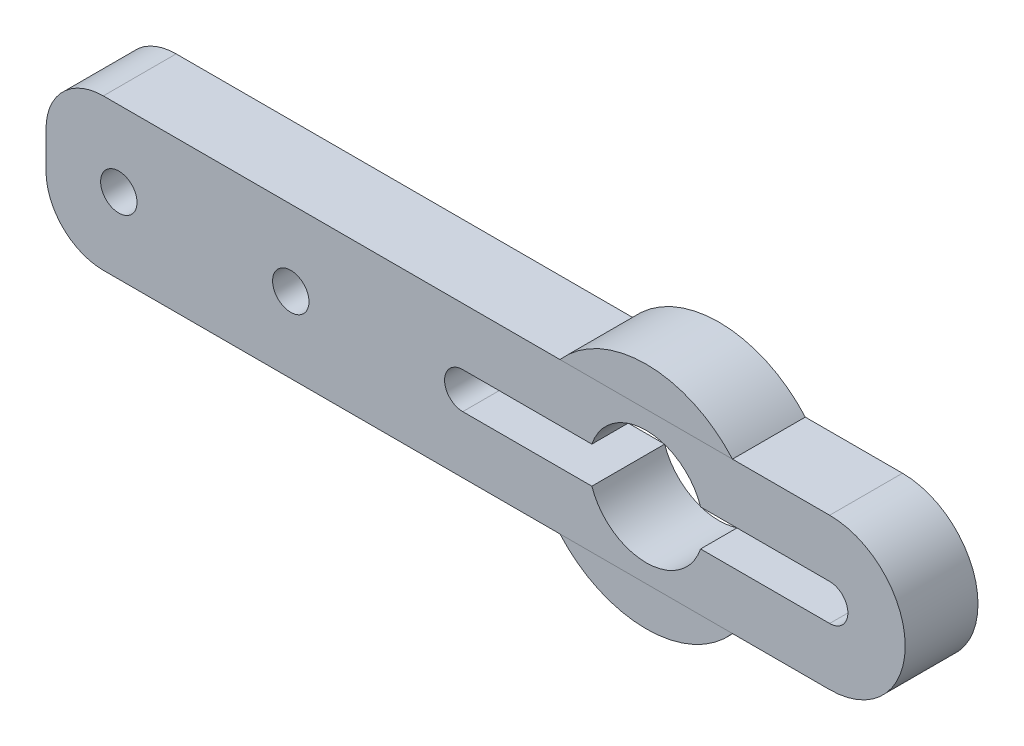
ISO-10303-21;
HEADER;
FILE_DESCRIPTION(('STEP AP214'),'2;1');
FILE_NAME('part.step','',(''),(''),'','','');
FILE_SCHEMA(('AUTOMOTIVE_DESIGN { 1 0 10303 214 1 1 1 1 }'));
ENDSEC;
DATA;
#1=APPLICATION_CONTEXT('core data for automotive mechanical design processes');
#2=APPLICATION_PROTOCOL_DEFINITION('international standard','automotive_design',2000,#1);
#3=PRODUCT_CONTEXT('',#1,'mechanical');
#4=PRODUCT('Part','Part','',(#3));
#5=PRODUCT_RELATED_PRODUCT_CATEGORY('part','',(#4));
#6=PRODUCT_DEFINITION_FORMATION('','',#4);
#7=PRODUCT_DEFINITION_CONTEXT('part definition',#1,'design');
#8=PRODUCT_DEFINITION('design','',#6,#7);
#9=PRODUCT_DEFINITION_SHAPE('','',#8);
#10=(LENGTH_UNIT() NAMED_UNIT(*) SI_UNIT(.MILLI.,.METRE.));
#11=(NAMED_UNIT(*) PLANE_ANGLE_UNIT() SI_UNIT($,.RADIAN.));
#12=(NAMED_UNIT(*) SI_UNIT($,.STERADIAN.) SOLID_ANGLE_UNIT());
#13=UNCERTAINTY_MEASURE_WITH_UNIT(LENGTH_MEASURE(1.E-05),#10,'distance_accuracy_value','');
#14=(GEOMETRIC_REPRESENTATION_CONTEXT(3) GLOBAL_UNCERTAINTY_ASSIGNED_CONTEXT((#13)) GLOBAL_UNIT_ASSIGNED_CONTEXT((#10,
#11,#12)) REPRESENTATION_CONTEXT('',''));
#15=CARTESIAN_POINT('',(0.,0.,0.));
#16=DIRECTION('',(0.,0.,1.));
#17=DIRECTION('',(1.,0.,0.));
#18=AXIS2_PLACEMENT_3D('',#15,#16,#17);
#19=CARTESIAN_POINT('',(0.,6.5875,0.));
#20=DIRECTION('',(0.,1.,0.));
#21=DIRECTION('',(0.,0.,1.));
#22=AXIS2_PLACEMENT_3D('',#19,#20,#21);
#23=PLANE('',#22);
#24=DIRECTION('',(-1.,0.,0.));
#25=VECTOR('',#24,1.);
#26=CARTESIAN_POINT('',(0.,6.5875,6.35));
#27=LINE('',#26,#25);
#28=CARTESIAN_POINT('',(23.5236190593357,6.5875,6.35));
#29=VERTEX_POINT('',#28);
#30=CARTESIAN_POINT('',(8.47638094066426,6.5875,6.35));
#31=VERTEX_POINT('',#30);
#32=EDGE_CURVE('E77',#29,#31,#27,.T.);
#33=ORIENTED_EDGE('',*,*,#32,.T.);
#34=DIRECTION('',(0.,0.,1.));
#35=VECTOR('',#34,1.);
#36=CARTESIAN_POINT('',(8.47638094066426,6.5875,0.));
#37=LINE('',#36,#35);
#38=CARTESIAN_POINT('',(8.47638094066426,6.5875,0.));
#39=VERTEX_POINT('',#38);
#40=EDGE_CURVE('E12',#39,#31,#37,.T.);
#41=ORIENTED_EDGE('',*,*,#40,.F.);
#42=DIRECTION('',(-1.,0.,0.));
#43=VECTOR('',#42,1.);
#44=CARTESIAN_POINT('',(0.,6.5875,0.));
#45=LINE('',#44,#43);
#46=CARTESIAN_POINT('',(23.5236190593357,6.5875,0.));
#47=VERTEX_POINT('',#46);
#48=EDGE_CURVE('E61',#47,#39,#45,.T.);
#49=ORIENTED_EDGE('',*,*,#48,.F.);
#50=DIRECTION('',(0.,0.,1.));
#51=VECTOR('',#50,1.);
#52=CARTESIAN_POINT('',(23.5236190593357,6.5875,0.));
#53=LINE('',#52,#51);
#54=EDGE_CURVE('E49',#47,#29,#53,.T.);
#55=ORIENTED_EDGE('',*,*,#54,.T.);
#56=EDGE_LOOP('',(#33,#41,#49,#55));
#57=FACE_BOUND('',#56,.T.);
#58=ADVANCED_FACE('F46',(#57),#23,.F.);
#59=CARTESIAN_POINT('',(16.,0.,0.));
#60=DIRECTION('',(0.,0.,1.));
#61=DIRECTION('',(1.,0.,0.));
#62=AXIS2_PLACEMENT_3D('',#59,#60,#61);
#63=CYLINDRICAL_SURFACE('',#62,10.);
#64=CARTESIAN_POINT('',(16.,0.,6.35));
#65=DIRECTION('',(0.,0.,1.));
#66=DIRECTION('',(1.,0.,0.));
#67=AXIS2_PLACEMENT_3D('',#64,#65,#66);
#68=CIRCLE('',#67,10.);
#69=EDGE_CURVE('E75',#29,#31,#68,.T.);
#70=ORIENTED_EDGE('',*,*,#69,.F.);
#71=ORIENTED_EDGE('',*,*,#54,.F.);
#72=CARTESIAN_POINT('',(16.,0.,0.));
#73=DIRECTION('',(0.,0.,1.));
#74=DIRECTION('',(1.,0.,0.));
#75=AXIS2_PLACEMENT_3D('',#72,#73,#74);
#76=CIRCLE('',#75,10.);
#77=EDGE_CURVE('E76',#47,#39,#76,.T.);
#78=ORIENTED_EDGE('',*,*,#77,.T.);
#79=ORIENTED_EDGE('',*,*,#40,.T.);
#80=EDGE_LOOP('',(#70,#71,#78,#79));
#81=FACE_BOUND('',#80,.T.);
#82=ADVANCED_FACE('F73',(#81),#63,.T.);
#83=CARTESIAN_POINT('',(0.,0.,0.));
#84=DIRECTION('',(0.,0.,1.));
#85=DIRECTION('',(1.,0.,0.));
#86=AXIS2_PLACEMENT_3D('',#83,#84,#85);
#87=PLANE('',#86);
#88=ORIENTED_EDGE('',*,*,#48,.T.);
#89=ORIENTED_EDGE('',*,*,#77,.F.);
#90=EDGE_LOOP('',(#88,#89));
#91=FACE_BOUND('',#90,.T.);
#92=ADVANCED_FACE('F85',(#91),#87,.F.);
#93=CARTESIAN_POINT('',(0.,0.,6.35));
#94=DIRECTION('',(0.,0.,1.));
#95=DIRECTION('',(1.,0.,0.));
#96=AXIS2_PLACEMENT_3D('',#93,#94,#95);
#97=PLANE('',#96);
#98=ORIENTED_EDGE('',*,*,#32,.F.);
#99=ORIENTED_EDGE('',*,*,#69,.T.);
#100=EDGE_LOOP('',(#98,#99));
#101=FACE_BOUND('',#100,.T.);
#102=ADVANCED_FACE('F80',(#101),#97,.T.);
#103=CLOSED_SHELL('',(#58,#82,#92,#102));
#104=MANIFOLD_SOLID_BREP('B2',#103);
#105=CARTESIAN_POINT('',(0.,-6.5875,0.));
#106=DIRECTION('',(0.,-1.,0.));
#107=DIRECTION('',(0.,0.,-1.));
#108=AXIS2_PLACEMENT_3D('',#105,#106,#107);
#109=PLANE('',#108);
#110=DIRECTION('',(1.,0.,0.));
#111=VECTOR('',#110,1.);
#112=CARTESIAN_POINT('',(0.,-6.5875,6.35));
#113=LINE('',#112,#111);
#114=CARTESIAN_POINT('',(8.47638094066426,-6.5875,6.35));
#115=VERTEX_POINT('',#114);
#116=CARTESIAN_POINT('',(23.5236190593357,-6.5875,6.35));
#117=VERTEX_POINT('',#116);
#118=EDGE_CURVE('E158',#115,#117,#113,.T.);
#119=ORIENTED_EDGE('',*,*,#118,.T.);
#120=DIRECTION('',(0.,0.,1.));
#121=VECTOR('',#120,1.);
#122=CARTESIAN_POINT('',(23.5236190593357,-6.5875,0.));
#123=LINE('',#122,#121);
#124=CARTESIAN_POINT('',(23.5236190593357,-6.5875,0.));
#125=VERTEX_POINT('',#124);
#126=EDGE_CURVE('E44',#125,#117,#123,.T.);
#127=ORIENTED_EDGE('',*,*,#126,.F.);
#128=DIRECTION('',(1.,0.,0.));
#129=VECTOR('',#128,1.);
#130=CARTESIAN_POINT('',(0.,-6.5875,0.));
#131=LINE('',#130,#129);
#132=CARTESIAN_POINT('',(8.47638094066426,-6.5875,0.));
#133=VERTEX_POINT('',#132);
#134=EDGE_CURVE('E142',#133,#125,#131,.T.);
#135=ORIENTED_EDGE('',*,*,#134,.F.);
#136=DIRECTION('',(0.,0.,1.));
#137=VECTOR('',#136,1.);
#138=CARTESIAN_POINT('',(8.47638094066426,-6.5875,0.));
#139=LINE('',#138,#137);
#140=EDGE_CURVE('E130',#133,#115,#139,.T.);
#141=ORIENTED_EDGE('',*,*,#140,.T.);
#142=EDGE_LOOP('',(#119,#127,#135,#141));
#143=FACE_BOUND('',#142,.T.);
#144=ADVANCED_FACE('F127',(#143),#109,.F.);
#145=CARTESIAN_POINT('',(16.,0.,0.));
#146=DIRECTION('',(0.,0.,1.));
#147=DIRECTION('',(1.,0.,0.));
#148=AXIS2_PLACEMENT_3D('',#145,#146,#147);
#149=CYLINDRICAL_SURFACE('',#148,10.);
#150=CARTESIAN_POINT('',(16.,0.,6.35));
#151=DIRECTION('',(0.,0.,1.));
#152=DIRECTION('',(1.,0.,0.));
#153=AXIS2_PLACEMENT_3D('',#150,#151,#152);
#154=CIRCLE('',#153,10.);
#155=EDGE_CURVE('E156',#115,#117,#154,.T.);
#156=ORIENTED_EDGE('',*,*,#155,.F.);
#157=ORIENTED_EDGE('',*,*,#140,.F.);
#158=CARTESIAN_POINT('',(16.,0.,0.));
#159=DIRECTION('',(0.,0.,1.));
#160=DIRECTION('',(1.,0.,0.));
#161=AXIS2_PLACEMENT_3D('',#158,#159,#160);
#162=CIRCLE('',#161,10.);
#163=EDGE_CURVE('E157',#133,#125,#162,.T.);
#164=ORIENTED_EDGE('',*,*,#163,.T.);
#165=ORIENTED_EDGE('',*,*,#126,.T.);
#166=EDGE_LOOP('',(#156,#157,#164,#165));
#167=FACE_BOUND('',#166,.T.);
#168=ADVANCED_FACE('F154',(#167),#149,.T.);
#169=CARTESIAN_POINT('',(0.,0.,0.));
#170=DIRECTION('',(0.,0.,1.));
#171=DIRECTION('',(1.,0.,0.));
#172=AXIS2_PLACEMENT_3D('',#169,#170,#171);
#173=PLANE('',#172);
#174=ORIENTED_EDGE('',*,*,#134,.T.);
#175=ORIENTED_EDGE('',*,*,#163,.F.);
#176=EDGE_LOOP('',(#174,#175));
#177=FACE_BOUND('',#176,.T.);
#178=ADVANCED_FACE('F166',(#177),#173,.F.);
#179=CARTESIAN_POINT('',(0.,0.,6.35));
#180=DIRECTION('',(0.,0.,1.));
#181=DIRECTION('',(1.,0.,0.));
#182=AXIS2_PLACEMENT_3D('',#179,#180,#181);
#183=PLANE('',#182);
#184=ORIENTED_EDGE('',*,*,#118,.F.);
#185=ORIENTED_EDGE('',*,*,#155,.T.);
#186=EDGE_LOOP('',(#184,#185));
#187=FACE_BOUND('',#186,.T.);
#188=ADVANCED_FACE('F161',(#187),#183,.T.);
#189=CLOSED_SHELL('',(#144,#168,#178,#188));
#190=MANIFOLD_SOLID_BREP('B6',#189);
#191=CARTESIAN_POINT('',(0.,-1.5875,6.35));
#192=DIRECTION('',(0.,1.,0.));
#193=DIRECTION('',(0.,0.,1.));
#194=AXIS2_PLACEMENT_3D('',#191,#192,#193);
#195=PLANE('',#194);
#196=DIRECTION('',(0.,0.,1.));
#197=VECTOR('',#196,1.);
#198=CARTESIAN_POINT('',(11.2587086410979,-1.5875,0.));
#199=LINE('',#198,#197);
#200=CARTESIAN_POINT('',(11.2587086410979,-1.5875,0.));
#201=VERTEX_POINT('',#200);
#202=CARTESIAN_POINT('',(11.2587086410979,-1.5875,6.35));
#203=VERTEX_POINT('',#202);
#204=EDGE_CURVE('E416',#201,#203,#199,.T.);
#205=ORIENTED_EDGE('',*,*,#204,.F.);
#206=DIRECTION('',(1.,0.,0.));
#207=VECTOR('',#206,1.);
#208=CARTESIAN_POINT('',(0.,-1.5875,0.));
#209=LINE('',#208,#207);
#210=CARTESIAN_POINT('',(0.,-1.5875,0.));
#211=VERTEX_POINT('',#210);
#212=EDGE_CURVE('E330',#211,#201,#209,.T.);
#213=ORIENTED_EDGE('',*,*,#212,.F.);
#214=DIRECTION('',(0.,0.,-1.));
#215=VECTOR('',#214,1.);
#216=CARTESIAN_POINT('',(0.,-1.5875,6.35));
#217=LINE('',#216,#215);
#218=CARTESIAN_POINT('',(0.,-1.5875,6.35));
#219=VERTEX_POINT('',#218);
#220=EDGE_CURVE('E344',#219,#211,#217,.T.);
#221=ORIENTED_EDGE('',*,*,#220,.F.);
#222=DIRECTION('',(1.,0.,0.));
#223=VECTOR('',#222,1.);
#224=CARTESIAN_POINT('',(0.,-1.5875,6.35));
#225=LINE('',#224,#223);
#226=EDGE_CURVE('E399',#219,#203,#225,.T.);
#227=ORIENTED_EDGE('',*,*,#226,.T.);
#228=EDGE_LOOP('',(#205,#213,#221,#227));
#229=FACE_BOUND('',#228,.T.);
#230=ADVANCED_FACE('F199',(#229),#195,.T.);
#231=CARTESIAN_POINT('',(0.,1.5875,6.35));
#232=DIRECTION('',(0.,-1.,0.));
#233=DIRECTION('',(0.,0.,-1.));
#234=AXIS2_PLACEMENT_3D('',#231,#232,#233);
#235=PLANE('',#234);
#236=DIRECTION('',(0.,0.,1.));
#237=VECTOR('',#236,1.);
#238=CARTESIAN_POINT('',(20.7412913589021,1.5875,0.));
#239=LINE('',#238,#237);
#240=CARTESIAN_POINT('',(20.7412913589021,1.5875,0.));
#241=VERTEX_POINT('',#240);
#242=CARTESIAN_POINT('',(20.7412913589021,1.5875,6.35));
#243=VERTEX_POINT('',#242);
#244=EDGE_CURVE('E125',#241,#243,#239,.T.);
#245=ORIENTED_EDGE('',*,*,#244,.F.);
#246=DIRECTION('',(-1.,0.,0.));
#247=VECTOR('',#246,1.);
#248=CARTESIAN_POINT('',(0.,1.5875,0.));
#249=LINE('',#248,#247);
#250=CARTESIAN_POINT('',(32.,1.5875,0.));
#251=VERTEX_POINT('',#250);
#252=EDGE_CURVE('E337',#251,#241,#249,.T.);
#253=ORIENTED_EDGE('',*,*,#252,.F.);
#254=DIRECTION('',(0.,0.,-1.));
#255=VECTOR('',#254,1.);
#256=CARTESIAN_POINT('',(32.,1.5875,6.35));
#257=LINE('',#256,#255);
#258=CARTESIAN_POINT('',(32.,1.5875,6.35));
#259=VERTEX_POINT('',#258);
#260=EDGE_CURVE('E316',#259,#251,#257,.T.);
#261=ORIENTED_EDGE('',*,*,#260,.F.);
#262=DIRECTION('',(-1.,0.,0.));
#263=VECTOR('',#262,1.);
#264=CARTESIAN_POINT('',(0.,1.5875,6.35));
#265=LINE('',#264,#263);
#266=EDGE_CURVE('E310',#259,#243,#265,.T.);
#267=ORIENTED_EDGE('',*,*,#266,.T.);
#268=EDGE_LOOP('',(#245,#253,#261,#267));
#269=FACE_BOUND('',#268,.T.);
#270=ADVANCED_FACE('F315',(#269),#235,.T.);
#271=CARTESIAN_POINT('',(0.,0.,6.35));
#272=DIRECTION('',(0.,0.,1.));
#273=DIRECTION('',(1.,0.,0.));
#274=AXIS2_PLACEMENT_3D('',#271,#272,#273);
#275=PLANE('',#274);
#276=CARTESIAN_POINT('',(16.,0.,6.35));
#277=DIRECTION('',(0.,0.,1.));
#278=DIRECTION('',(1.,0.,0.));
#279=AXIS2_PLACEMENT_3D('',#276,#277,#278);
#280=CIRCLE('',#279,5.);
#281=CARTESIAN_POINT('',(11.2587086410979,1.5875,6.35));
#282=VERTEX_POINT('',#281);
#283=EDGE_CURVE('E221',#243,#282,#280,.T.);
#284=ORIENTED_EDGE('',*,*,#283,.F.);
#285=ORIENTED_EDGE('',*,*,#266,.F.);
#286=CARTESIAN_POINT('',(32.,0.,6.35));
#287=DIRECTION('',(0.,0.,1.));
#288=DIRECTION('',(1.,0.,0.));
#289=AXIS2_PLACEMENT_3D('',#286,#287,#288);
#290=CIRCLE('',#289,1.5875);
#291=CARTESIAN_POINT('',(32.,-1.5875,6.35));
#292=VERTEX_POINT('',#291);
#293=EDGE_CURVE('E322',#292,#259,#290,.T.);
#294=ORIENTED_EDGE('',*,*,#293,.F.);
#295=CARTESIAN_POINT('',(20.7412913589021,-1.5875,6.35));
#296=VERTEX_POINT('',#295);
#297=EDGE_CURVE('E400',#296,#292,#225,.T.);
#298=ORIENTED_EDGE('',*,*,#297,.F.);
#299=EDGE_CURVE('E214',#203,#296,#280,.T.);
#300=ORIENTED_EDGE('',*,*,#299,.F.);
#301=ORIENTED_EDGE('',*,*,#226,.F.);
#302=CARTESIAN_POINT('',(0.,0.,6.35));
#303=DIRECTION('',(0.,0.,1.));
#304=DIRECTION('',(1.,0.,0.));
#305=AXIS2_PLACEMENT_3D('',#302,#303,#304);
#306=CIRCLE('',#305,1.5875);
#307=CARTESIAN_POINT('',(0.,1.5875,6.35));
#308=VERTEX_POINT('',#307);
#309=EDGE_CURVE('E338',#308,#219,#306,.T.);
#310=ORIENTED_EDGE('',*,*,#309,.F.);
#311=EDGE_CURVE('E312',#282,#308,#265,.T.);
#312=ORIENTED_EDGE('',*,*,#311,.F.);
#313=EDGE_LOOP('',(#284,#285,#294,#298,#300,#301,#310,#312));
#314=FACE_BOUND('',#313,.T.);
#315=DIRECTION('',(-1.,0.,0.));
#316=VECTOR('',#315,1.);
#317=CARTESIAN_POINT('',(0.,6.5875,6.35));
#318=LINE('',#317,#316);
#319=CARTESIAN_POINT('',(32.,6.5875,6.35));
#320=VERTEX_POINT('',#319);
#321=CARTESIAN_POINT('',(-31.35,6.5875,6.35));
#322=VERTEX_POINT('',#321);
#323=EDGE_CURVE('E353',#320,#322,#318,.T.);
#324=ORIENTED_EDGE('',*,*,#323,.T.);
#325=CARTESIAN_POINT('',(-31.35,1.5875,6.35));
#326=DIRECTION('',(0.,0.,1.));
#327=DIRECTION('',(1.,0.,0.));
#328=AXIS2_PLACEMENT_3D('',#325,#326,#327);
#329=CIRCLE('',#328,5.);
#330=CARTESIAN_POINT('',(-36.35,1.5875,6.35));
#331=VERTEX_POINT('',#330);
#332=EDGE_CURVE('E372',#322,#331,#329,.T.);
#333=ORIENTED_EDGE('',*,*,#332,.T.);
#334=DIRECTION('',(0.,-1.,0.));
#335=VECTOR('',#334,1.);
#336=CARTESIAN_POINT('',(-36.35,-6.5875,6.35));
#337=LINE('',#336,#335);
#338=CARTESIAN_POINT('',(-36.35,-1.5875,6.35));
#339=VERTEX_POINT('',#338);
#340=EDGE_CURVE('E403',#331,#339,#337,.T.);
#341=ORIENTED_EDGE('',*,*,#340,.T.);
#342=CARTESIAN_POINT('',(-31.35,-1.5875,6.35));
#343=DIRECTION('',(0.,0.,1.));
#344=DIRECTION('',(1.,0.,0.));
#345=AXIS2_PLACEMENT_3D('',#342,#343,#344);
#346=CIRCLE('',#345,5.);
#347=CARTESIAN_POINT('',(-31.35,-6.5875,6.35));
#348=VERTEX_POINT('',#347);
#349=EDGE_CURVE('E370',#339,#348,#346,.T.);
#350=ORIENTED_EDGE('',*,*,#349,.T.);
#351=DIRECTION('',(1.,0.,0.));
#352=VECTOR('',#351,1.);
#353=CARTESIAN_POINT('',(0.,-6.5875,6.35));
#354=LINE('',#353,#352);
#355=CARTESIAN_POINT('',(32.,-6.5875,6.35));
#356=VERTEX_POINT('',#355);
#357=EDGE_CURVE('E348',#348,#356,#354,.T.);
#358=ORIENTED_EDGE('',*,*,#357,.T.);
#359=CARTESIAN_POINT('',(32.,0.,6.35));
#360=DIRECTION('',(0.,0.,1.));
#361=DIRECTION('',(1.,0.,0.));
#362=AXIS2_PLACEMENT_3D('',#359,#360,#361);
#363=CIRCLE('',#362,6.5875);
#364=EDGE_CURVE('E350',#356,#320,#363,.T.);
#365=ORIENTED_EDGE('',*,*,#364,.T.);
#366=EDGE_LOOP('',(#324,#333,#341,#350,#358,#365));
#367=FACE_BOUND('',#366,.T.);
#368=CARTESIAN_POINT('',(-30.,0.,6.35));
#369=DIRECTION('',(0.,0.,1.));
#370=DIRECTION('',(1.,0.,0.));
#371=AXIS2_PLACEMENT_3D('',#368,#369,#370);
#372=CIRCLE('',#371,1.5875);
#373=CARTESIAN_POINT('',(-28.4125,0.,6.35));
#374=VERTEX_POINT('',#373);
#375=EDGE_CURVE('E418',#374,#374,#372,.T.);
#376=ORIENTED_EDGE('',*,*,#375,.F.);
#377=EDGE_LOOP('',(#376));
#378=FACE_BOUND('',#377,.T.);
#379=CARTESIAN_POINT('',(-15.,0.,6.35));
#380=DIRECTION('',(0.,0.,1.));
#381=DIRECTION('',(1.,0.,0.));
#382=AXIS2_PLACEMENT_3D('',#379,#380,#381);
#383=CIRCLE('',#382,1.5875);
#384=CARTESIAN_POINT('',(-13.4125,0.,6.35));
#385=VERTEX_POINT('',#384);
#386=EDGE_CURVE('E424',#385,#385,#383,.T.);
#387=ORIENTED_EDGE('',*,*,#386,.F.);
#388=EDGE_LOOP('',(#387));
#389=FACE_BOUND('',#388,.T.);
#390=ADVANCED_FACE('F307',(#314,#367,#378,#389),#275,.T.);
#391=CARTESIAN_POINT('',(0.,0.,0.));
#392=DIRECTION('',(0.,0.,1.));
#393=DIRECTION('',(1.,0.,0.));
#394=AXIS2_PLACEMENT_3D('',#391,#392,#393);
#395=PLANE('',#394);
#396=DIRECTION('',(0.,-1.,0.));
#397=VECTOR('',#396,1.);
#398=CARTESIAN_POINT('',(-36.35,-6.5875,0.));
#399=LINE('',#398,#397);
#400=CARTESIAN_POINT('',(-36.35,1.5875,0.));
#401=VERTEX_POINT('',#400);
#402=CARTESIAN_POINT('',(-36.35,-1.5875,0.));
#403=VERTEX_POINT('',#402);
#404=EDGE_CURVE('E329',#401,#403,#399,.T.);
#405=ORIENTED_EDGE('',*,*,#404,.F.);
#406=CARTESIAN_POINT('',(-31.35,1.5875,0.));
#407=DIRECTION('',(0.,0.,1.));
#408=DIRECTION('',(1.,0.,0.));
#409=AXIS2_PLACEMENT_3D('',#406,#407,#408);
#410=CIRCLE('',#409,5.);
#411=CARTESIAN_POINT('',(-31.35,6.5875,0.));
#412=VERTEX_POINT('',#411);
#413=EDGE_CURVE('E381',#401,#412,#410,.F.);
#414=ORIENTED_EDGE('',*,*,#413,.T.);
#415=DIRECTION('',(-1.,0.,0.));
#416=VECTOR('',#415,1.);
#417=CARTESIAN_POINT('',(0.,6.5875,0.));
#418=LINE('',#417,#416);
#419=CARTESIAN_POINT('',(32.,6.5875,0.));
#420=VERTEX_POINT('',#419);
#421=EDGE_CURVE('E351',#420,#412,#418,.T.);
#422=ORIENTED_EDGE('',*,*,#421,.F.);
#423=CARTESIAN_POINT('',(32.,0.,0.));
#424=DIRECTION('',(0.,0.,1.));
#425=DIRECTION('',(1.,0.,0.));
#426=AXIS2_PLACEMENT_3D('',#423,#424,#425);
#427=CIRCLE('',#426,6.5875);
#428=CARTESIAN_POINT('',(32.,-6.5875,0.));
#429=VERTEX_POINT('',#428);
#430=EDGE_CURVE('E358',#429,#420,#427,.T.);
#431=ORIENTED_EDGE('',*,*,#430,.F.);
#432=DIRECTION('',(1.,0.,0.));
#433=VECTOR('',#432,1.);
#434=CARTESIAN_POINT('',(0.,-6.5875,0.));
#435=LINE('',#434,#433);
#436=CARTESIAN_POINT('',(-31.35,-6.5875,0.));
#437=VERTEX_POINT('',#436);
#438=EDGE_CURVE('E347',#437,#429,#435,.T.);
#439=ORIENTED_EDGE('',*,*,#438,.F.);
#440=CARTESIAN_POINT('',(-31.35,-1.5875,0.));
#441=DIRECTION('',(0.,0.,1.));
#442=DIRECTION('',(1.,0.,0.));
#443=AXIS2_PLACEMENT_3D('',#440,#441,#442);
#444=CIRCLE('',#443,5.);
#445=EDGE_CURVE('E379',#437,#403,#444,.F.);
#446=ORIENTED_EDGE('',*,*,#445,.T.);
#447=EDGE_LOOP('',(#405,#414,#422,#431,#439,#446));
#448=FACE_BOUND('',#447,.T.);
#449=ORIENTED_EDGE('',*,*,#252,.T.);
#450=CARTESIAN_POINT('',(16.,0.,0.));
#451=DIRECTION('',(0.,0.,1.));
#452=DIRECTION('',(1.,0.,0.));
#453=AXIS2_PLACEMENT_3D('',#450,#451,#452);
#454=CIRCLE('',#453,5.);
#455=CARTESIAN_POINT('',(11.2587086410979,1.5875,0.));
#456=VERTEX_POINT('',#455);
#457=EDGE_CURVE('E299',#241,#456,#454,.T.);
#458=ORIENTED_EDGE('',*,*,#457,.T.);
#459=CARTESIAN_POINT('',(0.,1.5875,0.));
#460=VERTEX_POINT('',#459);
#461=EDGE_CURVE('E336',#456,#460,#249,.T.);
#462=ORIENTED_EDGE('',*,*,#461,.T.);
#463=CARTESIAN_POINT('',(0.,0.,0.));
#464=DIRECTION('',(0.,0.,1.));
#465=DIRECTION('',(1.,0.,0.));
#466=AXIS2_PLACEMENT_3D('',#463,#464,#465);
#467=CIRCLE('',#466,1.5875);
#468=EDGE_CURVE('E326',#460,#211,#467,.T.);
#469=ORIENTED_EDGE('',*,*,#468,.T.);
#470=ORIENTED_EDGE('',*,*,#212,.T.);
#471=CARTESIAN_POINT('',(20.7412913589021,-1.5875,0.));
#472=VERTEX_POINT('',#471);
#473=EDGE_CURVE('E313',#201,#472,#454,.T.);
#474=ORIENTED_EDGE('',*,*,#473,.T.);
#475=CARTESIAN_POINT('',(32.,-1.5875,0.));
#476=VERTEX_POINT('',#475);
#477=EDGE_CURVE('E328',#472,#476,#209,.T.);
#478=ORIENTED_EDGE('',*,*,#477,.T.);
#479=CARTESIAN_POINT('',(32.,0.,0.));
#480=DIRECTION('',(0.,0.,1.));
#481=DIRECTION('',(1.,0.,0.));
#482=AXIS2_PLACEMENT_3D('',#479,#480,#481);
#483=CIRCLE('',#482,1.5875);
#484=EDGE_CURVE('E333',#476,#251,#483,.T.);
#485=ORIENTED_EDGE('',*,*,#484,.T.);
#486=EDGE_LOOP('',(#449,#458,#462,#469,#470,#474,#478,#485));
#487=FACE_BOUND('',#486,.T.);
#488=CARTESIAN_POINT('',(-30.,0.,0.));
#489=DIRECTION('',(0.,0.,1.));
#490=DIRECTION('',(1.,0.,0.));
#491=AXIS2_PLACEMENT_3D('',#488,#489,#490);
#492=CIRCLE('',#491,1.5875);
#493=CARTESIAN_POINT('',(-28.4125,0.,0.));
#494=VERTEX_POINT('',#493);
#495=EDGE_CURVE('E421',#494,#494,#492,.T.);
#496=ORIENTED_EDGE('',*,*,#495,.T.);
#497=EDGE_LOOP('',(#496));
#498=FACE_BOUND('',#497,.T.);
#499=CARTESIAN_POINT('',(-15.,0.,0.));
#500=DIRECTION('',(0.,0.,1.));
#501=DIRECTION('',(1.,0.,0.));
#502=AXIS2_PLACEMENT_3D('',#499,#500,#501);
#503=CIRCLE('',#502,1.5875);
#504=CARTESIAN_POINT('',(-13.4125,0.,0.));
#505=VERTEX_POINT('',#504);
#506=EDGE_CURVE('E427',#505,#505,#503,.T.);
#507=ORIENTED_EDGE('',*,*,#506,.T.);
#508=EDGE_LOOP('',(#507));
#509=FACE_BOUND('',#508,.T.);
#510=ADVANCED_FACE('F387',(#448,#487,#498,#509),#395,.F.);
#511=CARTESIAN_POINT('',(0.,-6.5875,6.35));
#512=DIRECTION('',(0.,1.,0.));
#513=DIRECTION('',(0.,0.,1.));
#514=AXIS2_PLACEMENT_3D('',#511,#512,#513);
#515=PLANE('',#514);
#516=ORIENTED_EDGE('',*,*,#357,.F.);
#517=DIRECTION('',(0.,0.,1.));
#518=VECTOR('',#517,1.);
#519=CARTESIAN_POINT('',(-31.35,-6.5875,0.));
#520=LINE('',#519,#518);
#521=EDGE_CURVE('E383',#348,#437,#520,.F.);
#522=ORIENTED_EDGE('',*,*,#521,.T.);
#523=ORIENTED_EDGE('',*,*,#438,.T.);
#524=DIRECTION('',(0.,0.,-1.));
#525=VECTOR('',#524,1.);
#526=CARTESIAN_POINT('',(32.,-6.5875,6.35));
#527=LINE('',#526,#525);
#528=EDGE_CURVE('E364',#356,#429,#527,.T.);
#529=ORIENTED_EDGE('',*,*,#528,.F.);
#530=EDGE_LOOP('',(#516,#522,#523,#529));
#531=FACE_BOUND('',#530,.T.);
#532=ADVANCED_FACE('F461',(#531),#515,.F.);
#533=CARTESIAN_POINT('',(32.,0.,6.35));
#534=DIRECTION('',(0.,0.,-1.));
#535=DIRECTION('',(-1.,0.,0.));
#536=AXIS2_PLACEMENT_3D('',#533,#534,#535);
#537=CYLINDRICAL_SURFACE('',#536,6.5875);
#538=ORIENTED_EDGE('',*,*,#430,.T.);
#539=DIRECTION('',(0.,0.,-1.));
#540=VECTOR('',#539,1.);
#541=CARTESIAN_POINT('',(32.,6.5875,6.35));
#542=LINE('',#541,#540);
#543=EDGE_CURVE('E356',#320,#420,#542,.T.);
#544=ORIENTED_EDGE('',*,*,#543,.F.);
#545=ORIENTED_EDGE('',*,*,#364,.F.);
#546=ORIENTED_EDGE('',*,*,#528,.T.);
#547=EDGE_LOOP('',(#538,#544,#545,#546));
#548=FACE_BOUND('',#547,.T.);
#549=ADVANCED_FACE('F454',(#548),#537,.T.);
#550=CARTESIAN_POINT('',(0.,6.5875,6.35));
#551=DIRECTION('',(0.,-1.,0.));
#552=DIRECTION('',(0.,0.,-1.));
#553=AXIS2_PLACEMENT_3D('',#550,#551,#552);
#554=PLANE('',#553);
#555=ORIENTED_EDGE('',*,*,#421,.T.);
#556=DIRECTION('',(0.,0.,1.));
#557=VECTOR('',#556,1.);
#558=CARTESIAN_POINT('',(-31.35,6.5875,6.35));
#559=LINE('',#558,#557);
#560=EDGE_CURVE('E367',#412,#322,#559,.T.);
#561=ORIENTED_EDGE('',*,*,#560,.T.);
#562=ORIENTED_EDGE('',*,*,#323,.F.);
#563=ORIENTED_EDGE('',*,*,#543,.T.);
#564=EDGE_LOOP('',(#555,#561,#562,#563));
#565=FACE_BOUND('',#564,.T.);
#566=ADVANCED_FACE('F449',(#565),#554,.F.);
#567=CARTESIAN_POINT('',(0.,0.,6.35));
#568=DIRECTION('',(0.,0.,-1.));
#569=DIRECTION('',(-1.,0.,0.));
#570=AXIS2_PLACEMENT_3D('',#567,#568,#569);
#571=CYLINDRICAL_SURFACE('',#570,1.5875);
#572=ORIENTED_EDGE('',*,*,#220,.T.);
#573=ORIENTED_EDGE('',*,*,#468,.F.);
#574=DIRECTION('',(0.,0.,-1.));
#575=VECTOR('',#574,1.);
#576=CARTESIAN_POINT('',(0.,1.5875,6.35));
#577=LINE('',#576,#575);
#578=EDGE_CURVE('E318',#308,#460,#577,.T.);
#579=ORIENTED_EDGE('',*,*,#578,.F.);
#580=ORIENTED_EDGE('',*,*,#309,.T.);
#581=EDGE_LOOP('',(#572,#573,#579,#580));
#582=FACE_BOUND('',#581,.T.);
#583=ADVANCED_FACE('F395',(#582),#571,.F.);
#584=DIRECTION('',(0.,0.,1.));
#585=VECTOR('',#584,1.);
#586=CARTESIAN_POINT('',(20.7412913589021,-1.5875,0.));
#587=LINE('',#586,#585);
#588=EDGE_CURVE('E390',#296,#472,#587,.F.);
#589=ORIENTED_EDGE('',*,*,#588,.F.);
#590=ORIENTED_EDGE('',*,*,#297,.T.);
#591=DIRECTION('',(0.,0.,-1.));
#592=VECTOR('',#591,1.);
#593=CARTESIAN_POINT('',(32.,-1.5875,6.35));
#594=LINE('',#593,#592);
#595=EDGE_CURVE('E341',#292,#476,#594,.T.);
#596=ORIENTED_EDGE('',*,*,#595,.T.);
#597=ORIENTED_EDGE('',*,*,#477,.F.);
#598=EDGE_LOOP('',(#589,#590,#596,#597));
#599=FACE_BOUND('',#598,.T.);
#600=ADVANCED_FACE('F413',(#599),#195,.T.);
#601=CARTESIAN_POINT('',(32.,0.,6.35));
#602=DIRECTION('',(0.,0.,-1.));
#603=DIRECTION('',(-1.,0.,0.));
#604=AXIS2_PLACEMENT_3D('',#601,#602,#603);
#605=CYLINDRICAL_SURFACE('',#604,1.5875);
#606=ORIENTED_EDGE('',*,*,#484,.F.);
#607=ORIENTED_EDGE('',*,*,#595,.F.);
#608=ORIENTED_EDGE('',*,*,#293,.T.);
#609=ORIENTED_EDGE('',*,*,#260,.T.);
#610=EDGE_LOOP('',(#606,#607,#608,#609));
#611=FACE_BOUND('',#610,.T.);
#612=ADVANCED_FACE('F410',(#611),#605,.F.);
#613=DIRECTION('',(0.,0.,1.));
#614=VECTOR('',#613,1.);
#615=CARTESIAN_POINT('',(11.2587086410979,1.5875,0.));
#616=LINE('',#615,#614);
#617=EDGE_CURVE('E207',#282,#456,#616,.F.);
#618=ORIENTED_EDGE('',*,*,#617,.F.);
#619=ORIENTED_EDGE('',*,*,#311,.T.);
#620=ORIENTED_EDGE('',*,*,#578,.T.);
#621=ORIENTED_EDGE('',*,*,#461,.F.);
#622=EDGE_LOOP('',(#618,#619,#620,#621));
#623=FACE_BOUND('',#622,.T.);
#624=ADVANCED_FACE('F392',(#623),#235,.T.);
#625=CARTESIAN_POINT('',(-36.35,-6.5875,0.));
#626=DIRECTION('',(-1.,0.,0.));
#627=DIRECTION('',(0.,0.,1.));
#628=AXIS2_PLACEMENT_3D('',#625,#626,#627);
#629=PLANE('',#628);
#630=ORIENTED_EDGE('',*,*,#340,.F.);
#631=DIRECTION('',(0.,0.,1.));
#632=VECTOR('',#631,1.);
#633=CARTESIAN_POINT('',(-36.35,1.5875,0.));
#634=LINE('',#633,#632);
#635=EDGE_CURVE('E377',#331,#401,#634,.F.);
#636=ORIENTED_EDGE('',*,*,#635,.T.);
#637=ORIENTED_EDGE('',*,*,#404,.T.);
#638=DIRECTION('',(0.,0.,1.));
#639=VECTOR('',#638,1.);
#640=CARTESIAN_POINT('',(-36.35,-1.5875,6.35));
#641=LINE('',#640,#639);
#642=EDGE_CURVE('E374',#403,#339,#641,.T.);
#643=ORIENTED_EDGE('',*,*,#642,.T.);
#644=EDGE_LOOP('',(#630,#636,#637,#643));
#645=FACE_BOUND('',#644,.T.);
#646=ADVANCED_FACE('F440',(#645),#629,.T.);
#647=CARTESIAN_POINT('',(-15.,0.,0.));
#648=DIRECTION('',(0.,0.,1.));
#649=DIRECTION('',(1.,0.,0.));
#650=AXIS2_PLACEMENT_3D('',#647,#648,#649);
#651=CYLINDRICAL_SURFACE('',#650,1.5875);
#652=ORIENTED_EDGE('',*,*,#506,.F.);
#653=EDGE_LOOP('',(#652));
#654=FACE_BOUND('',#653,.T.);
#655=ORIENTED_EDGE('',*,*,#386,.T.);
#656=EDGE_LOOP('',(#655));
#657=FACE_BOUND('',#656,.T.);
#658=ADVANCED_FACE('F539',(#654,#657),#651,.F.);
#659=CARTESIAN_POINT('',(-30.,0.,0.));
#660=DIRECTION('',(0.,0.,1.));
#661=DIRECTION('',(1.,0.,0.));
#662=AXIS2_PLACEMENT_3D('',#659,#660,#661);
#663=CYLINDRICAL_SURFACE('',#662,1.5875);
#664=ORIENTED_EDGE('',*,*,#495,.F.);
#665=EDGE_LOOP('',(#664));
#666=FACE_BOUND('',#665,.T.);
#667=ORIENTED_EDGE('',*,*,#375,.T.);
#668=EDGE_LOOP('',(#667));
#669=FACE_BOUND('',#668,.T.);
#670=ADVANCED_FACE('F536',(#666,#669),#663,.F.);
#671=CARTESIAN_POINT('',(-31.35,1.5875,6.35));
#672=DIRECTION('',(0.,0.,-1.));
#673=DIRECTION('',(-1.,0.,0.));
#674=AXIS2_PLACEMENT_3D('',#671,#672,#673);
#675=CYLINDRICAL_SURFACE('',#674,5.);
#676=ORIENTED_EDGE('',*,*,#413,.F.);
#677=ORIENTED_EDGE('',*,*,#635,.F.);
#678=ORIENTED_EDGE('',*,*,#332,.F.);
#679=ORIENTED_EDGE('',*,*,#560,.F.);
#680=EDGE_LOOP('',(#676,#677,#678,#679));
#681=FACE_BOUND('',#680,.T.);
#682=ADVANCED_FACE('F443',(#681),#675,.T.);
#683=CARTESIAN_POINT('',(-31.35,-1.5875,0.));
#684=DIRECTION('',(0.,0.,-1.));
#685=DIRECTION('',(-1.,0.,0.));
#686=AXIS2_PLACEMENT_3D('',#683,#684,#685);
#687=CYLINDRICAL_SURFACE('',#686,5.);
#688=ORIENTED_EDGE('',*,*,#445,.F.);
#689=ORIENTED_EDGE('',*,*,#521,.F.);
#690=ORIENTED_EDGE('',*,*,#349,.F.);
#691=ORIENTED_EDGE('',*,*,#642,.F.);
#692=EDGE_LOOP('',(#688,#689,#690,#691));
#693=FACE_BOUND('',#692,.T.);
#694=ADVANCED_FACE('F201',(#693),#687,.T.);
#695=CARTESIAN_POINT('',(16.,0.,0.));
#696=DIRECTION('',(0.,0.,1.));
#697=DIRECTION('',(1.,0.,0.));
#698=AXIS2_PLACEMENT_3D('',#695,#696,#697);
#699=CYLINDRICAL_SURFACE('',#698,5.);
#700=ORIENTED_EDGE('',*,*,#244,.T.);
#701=ORIENTED_EDGE('',*,*,#283,.T.);
#702=ORIENTED_EDGE('',*,*,#617,.T.);
#703=ORIENTED_EDGE('',*,*,#457,.F.);
#704=EDGE_LOOP('',(#700,#701,#702,#703));
#705=FACE_BOUND('',#704,.T.);
#706=ADVANCED_FACE('F297',(#705),#699,.F.);
#707=ORIENTED_EDGE('',*,*,#204,.T.);
#708=ORIENTED_EDGE('',*,*,#299,.T.);
#709=ORIENTED_EDGE('',*,*,#588,.T.);
#710=ORIENTED_EDGE('',*,*,#473,.F.);
#711=EDGE_LOOP('',(#707,#708,#709,#710));
#712=FACE_BOUND('',#711,.T.);
#713=ADVANCED_FACE('F522',(#712),#699,.F.);
#714=CLOSED_SHELL('',(#230,#270,#390,#510,#532,#549,#566,#583,#600,#612,#624,#646,#658,#670,
#682,#694,#706,#713));
#715=MANIFOLD_SOLID_BREP('B38',#714);
#716=ADVANCED_BREP_SHAPE_REPRESENTATION('',(#18,#104,#190,#715),#14);
#717=SHAPE_DEFINITION_REPRESENTATION(#9,#716);
ENDSEC;
END-ISO-10303-21;
